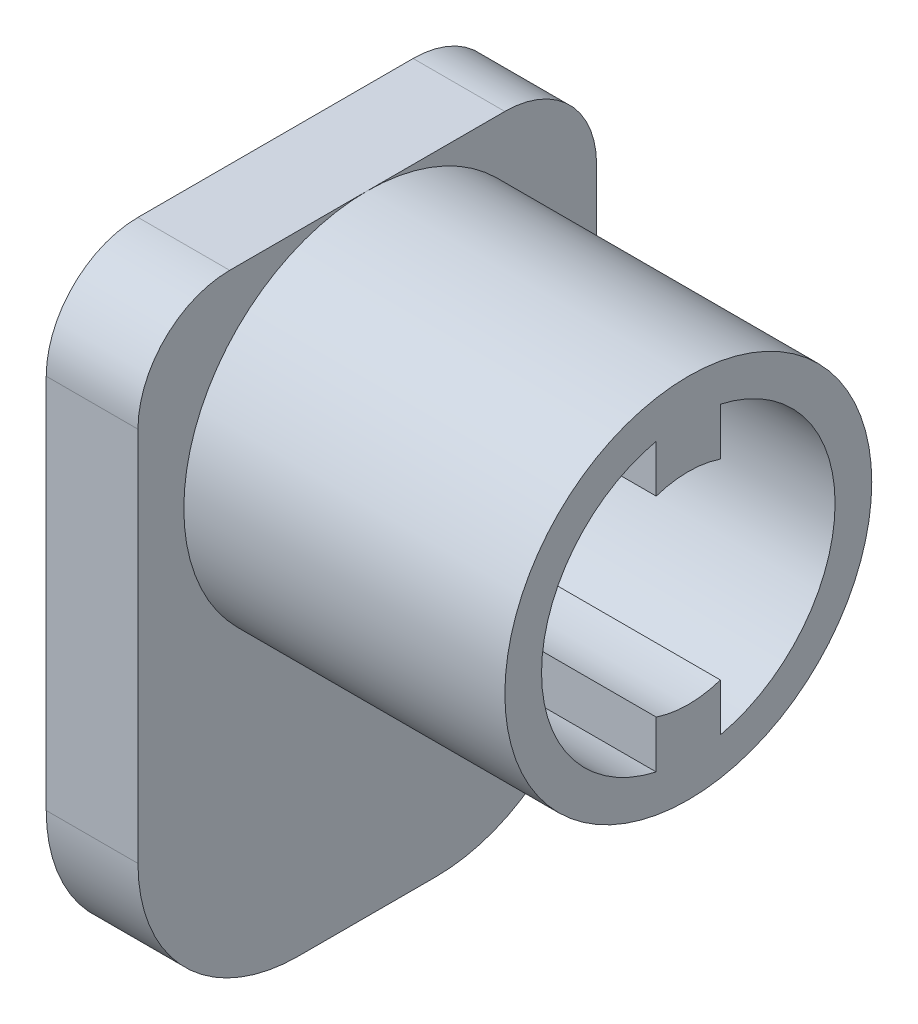
ISO-10303-21;
HEADER;
FILE_DESCRIPTION(('STEP AP214'),'2;1');
FILE_NAME('part.step','',(''),(''),'','','');
FILE_SCHEMA(('AUTOMOTIVE_DESIGN { 1 0 10303 214 1 1 1 1 }'));
ENDSEC;
DATA;
#1=APPLICATION_CONTEXT('core data for automotive mechanical design processes');
#2=APPLICATION_PROTOCOL_DEFINITION('international standard','automotive_design',2000,#1);
#3=PRODUCT_CONTEXT('',#1,'mechanical');
#4=PRODUCT('Part','Part','',(#3));
#5=PRODUCT_RELATED_PRODUCT_CATEGORY('part','',(#4));
#6=PRODUCT_DEFINITION_FORMATION('','',#4);
#7=PRODUCT_DEFINITION_CONTEXT('part definition',#1,'design');
#8=PRODUCT_DEFINITION('design','',#6,#7);
#9=PRODUCT_DEFINITION_SHAPE('','',#8);
#10=(LENGTH_UNIT() NAMED_UNIT(*) SI_UNIT(.MILLI.,.METRE.));
#11=(NAMED_UNIT(*) PLANE_ANGLE_UNIT() SI_UNIT($,.RADIAN.));
#12=(NAMED_UNIT(*) SI_UNIT($,.STERADIAN.) SOLID_ANGLE_UNIT());
#13=UNCERTAINTY_MEASURE_WITH_UNIT(LENGTH_MEASURE(1.E-05),#10,'distance_accuracy_value','');
#14=(GEOMETRIC_REPRESENTATION_CONTEXT(3) GLOBAL_UNCERTAINTY_ASSIGNED_CONTEXT((#13)) GLOBAL_UNIT_ASSIGNED_CONTEXT((#10,
#11,#12)) REPRESENTATION_CONTEXT('',''));
#15=CARTESIAN_POINT('',(0.,0.,0.));
#16=DIRECTION('',(0.,0.,1.));
#17=DIRECTION('',(1.,0.,0.));
#18=AXIS2_PLACEMENT_3D('',#15,#16,#17);
#19=CARTESIAN_POINT('',(-16.0509667991878,0.,0.));
#20=DIRECTION('',(1.,0.,0.));
#21=DIRECTION('',(0.,0.,-1.));
#22=AXIS2_PLACEMENT_3D('',#19,#20,#21);
#23=CYLINDRICAL_SURFACE('',#22,3.2);
#24=CARTESIAN_POINT('',(-7.,0.,0.));
#25=DIRECTION('',(-1.,0.,0.));
#26=DIRECTION('',(0.,0.,1.));
#27=AXIS2_PLACEMENT_3D('',#24,#25,#26);
#28=CIRCLE('',#27,3.2);
#29=CARTESIAN_POINT('',(-7.,3.1224989991992,0.7));
#30=VERTEX_POINT('',#29);
#31=CARTESIAN_POINT('',(-7.,-3.1224989991992,0.699999999999999));
#32=VERTEX_POINT('',#31);
#33=EDGE_CURVE('E165',#30,#32,#28,.F.);
#34=ORIENTED_EDGE('',*,*,#33,.F.);
#35=DIRECTION('',(-1.,0.,0.));
#36=VECTOR('',#35,1.);
#37=CARTESIAN_POINT('',(1.78934113199437,3.1224989991992,0.7));
#38=LINE('',#37,#36);
#39=CARTESIAN_POINT('',(0.,3.1224989991992,0.7));
#40=VERTEX_POINT('',#39);
#41=EDGE_CURVE('E152',#40,#30,#38,.T.);
#42=ORIENTED_EDGE('',*,*,#41,.F.);
#43=CARTESIAN_POINT('',(0.,0.,0.));
#44=DIRECTION('',(1.,0.,0.));
#45=DIRECTION('',(0.,0.,-1.));
#46=AXIS2_PLACEMENT_3D('',#43,#44,#45);
#47=CIRCLE('',#46,3.2);
#48=CARTESIAN_POINT('',(0.,-3.1224989991992,0.7));
#49=VERTEX_POINT('',#48);
#50=EDGE_CURVE('E163',#40,#49,#47,.T.);
#51=ORIENTED_EDGE('',*,*,#50,.T.);
#52=DIRECTION('',(-1.,0.,0.));
#53=VECTOR('',#52,1.);
#54=CARTESIAN_POINT('',(1.78934113199437,-3.1224989991992,0.7));
#55=LINE('',#54,#53);
#56=EDGE_CURVE('E338',#49,#32,#55,.T.);
#57=ORIENTED_EDGE('',*,*,#56,.T.);
#58=EDGE_LOOP('',(#34,#42,#51,#57));
#59=FACE_BOUND('',#58,.T.);
#60=ADVANCED_FACE('F31',(#59),#23,.F.);
#61=CARTESIAN_POINT('',(-7.,0.,0.));
#62=DIRECTION('',(1.,0.,0.));
#63=DIRECTION('',(0.,0.,-1.));
#64=AXIS2_PLACEMENT_3D('',#61,#62,#63);
#65=CYLINDRICAL_SURFACE('',#64,4.);
#66=CARTESIAN_POINT('',(-7.,0.,0.));
#67=DIRECTION('',(1.,0.,0.));
#68=DIRECTION('',(0.,0.,-1.));
#69=AXIS2_PLACEMENT_3D('',#66,#67,#68);
#70=CIRCLE('',#69,4.);
#71=CARTESIAN_POINT('',(-7.,4.,0.));
#72=VERTEX_POINT('',#71);
#73=EDGE_CURVE('E207',#72,#72,#70,.T.);
#74=ORIENTED_EDGE('',*,*,#73,.T.);
#75=EDGE_LOOP('',(#74));
#76=FACE_BOUND('',#75,.T.);
#77=CARTESIAN_POINT('',(0.,0.,0.));
#78=DIRECTION('',(1.,0.,0.));
#79=DIRECTION('',(0.,0.,-1.));
#80=AXIS2_PLACEMENT_3D('',#77,#78,#79);
#81=CIRCLE('',#80,4.);
#82=CARTESIAN_POINT('',(0.,0.,-4.));
#83=VERTEX_POINT('',#82);
#84=EDGE_CURVE('E198',#83,#83,#81,.T.);
#85=ORIENTED_EDGE('',*,*,#84,.F.);
#86=EDGE_LOOP('',(#85));
#87=FACE_BOUND('',#86,.T.);
#88=ADVANCED_FACE('F278',(#76,#87),#65,.T.);
#89=CARTESIAN_POINT('',(0.,0.,0.));
#90=DIRECTION('',(1.,0.,0.));
#91=DIRECTION('',(0.,0.,-1.));
#92=AXIS2_PLACEMENT_3D('',#89,#90,#91);
#93=PLANE('',#92);
#94=CARTESIAN_POINT('',(0.,-3.1224989991992,-0.7));
#95=VERTEX_POINT('',#94);
#96=CARTESIAN_POINT('',(0.,3.1224989991992,-0.700000000000001));
#97=VERTEX_POINT('',#96);
#98=EDGE_CURVE('E174',#95,#97,#47,.T.);
#99=ORIENTED_EDGE('',*,*,#98,.F.);
#100=DIRECTION('',(0.,-1.,0.));
#101=VECTOR('',#100,1.);
#102=CARTESIAN_POINT('',(0.,-2.86181760425084,-0.700000000000001));
#103=LINE('',#102,#101);
#104=CARTESIAN_POINT('',(0.,-2.08566536146142,-0.700000000000001));
#105=VERTEX_POINT('',#104);
#106=EDGE_CURVE('E312',#105,#95,#103,.T.);
#107=ORIENTED_EDGE('',*,*,#106,.F.);
#108=CARTESIAN_POINT('',(0.,0.,0.));
#109=DIRECTION('',(1.,0.,0.));
#110=DIRECTION('',(0.,0.,-1.));
#111=AXIS2_PLACEMENT_3D('',#108,#109,#110);
#112=CIRCLE('',#111,2.2);
#113=CARTESIAN_POINT('',(0.,-2.08566536146142,0.7));
#114=VERTEX_POINT('',#113);
#115=EDGE_CURVE('E333',#114,#105,#112,.T.);
#116=ORIENTED_EDGE('',*,*,#115,.F.);
#117=DIRECTION('',(0.,1.,0.));
#118=VECTOR('',#117,1.);
#119=CARTESIAN_POINT('',(0.,-2.86181760425084,0.699999999999999));
#120=LINE('',#119,#118);
#121=EDGE_CURVE('E172',#49,#114,#120,.T.);
#122=ORIENTED_EDGE('',*,*,#121,.F.);
#123=ORIENTED_EDGE('',*,*,#50,.F.);
#124=DIRECTION('',(0.,1.,0.));
#125=VECTOR('',#124,1.);
#126=CARTESIAN_POINT('',(0.,2.86181760425084,0.7));
#127=LINE('',#126,#125);
#128=CARTESIAN_POINT('',(0.,2.08566536146142,0.699999999999999));
#129=VERTEX_POINT('',#128);
#130=EDGE_CURVE('E149',#129,#40,#127,.T.);
#131=ORIENTED_EDGE('',*,*,#130,.F.);
#132=CARTESIAN_POINT('',(0.,0.,0.));
#133=DIRECTION('',(1.,0.,0.));
#134=DIRECTION('',(0.,0.,-1.));
#135=AXIS2_PLACEMENT_3D('',#132,#133,#134);
#136=CIRCLE('',#135,2.2);
#137=CARTESIAN_POINT('',(0.,2.08566536146142,-0.700000000000001));
#138=VERTEX_POINT('',#137);
#139=EDGE_CURVE('E316',#138,#129,#136,.T.);
#140=ORIENTED_EDGE('',*,*,#139,.F.);
#141=DIRECTION('',(0.,-1.,0.));
#142=VECTOR('',#141,1.);
#143=CARTESIAN_POINT('',(0.,2.08566536146142,-0.700000000000001));
#144=LINE('',#143,#142);
#145=EDGE_CURVE('E315',#97,#138,#144,.T.);
#146=ORIENTED_EDGE('',*,*,#145,.F.);
#147=EDGE_LOOP('',(#99,#107,#116,#122,#123,#131,#140,#146));
#148=FACE_BOUND('',#147,.T.);
#149=ORIENTED_EDGE('',*,*,#84,.T.);
#150=EDGE_LOOP('',(#149));
#151=FACE_BOUND('',#150,.T.);
#152=ADVANCED_FACE('F169',(#148,#151),#93,.T.);
#153=CARTESIAN_POINT('',(-9.,4.,-5.));
#154=DIRECTION('',(0.,0.,1.));
#155=DIRECTION('',(0.,-1.,0.));
#156=AXIS2_PLACEMENT_3D('',#153,#154,#155);
#157=PLANE('',#156);
#158=DIRECTION('',(0.,-1.,0.));
#159=VECTOR('',#158,1.);
#160=CARTESIAN_POINT('',(-7.,4.,-5.));
#161=LINE('',#160,#159);
#162=CARTESIAN_POINT('',(-7.,2.,-5.));
#163=VERTEX_POINT('',#162);
#164=CARTESIAN_POINT('',(-7.,-6.2,-5.));
#165=VERTEX_POINT('',#164);
#166=EDGE_CURVE('E187',#163,#165,#161,.T.);
#167=ORIENTED_EDGE('',*,*,#166,.T.);
#168=DIRECTION('',(1.,0.,0.));
#169=VECTOR('',#168,1.);
#170=CARTESIAN_POINT('',(-9.,-6.2,-5.));
#171=LINE('',#170,#169);
#172=CARTESIAN_POINT('',(-9.,-6.2,-5.));
#173=VERTEX_POINT('',#172);
#174=EDGE_CURVE('E54',#165,#173,#171,.F.);
#175=ORIENTED_EDGE('',*,*,#174,.T.);
#176=DIRECTION('',(0.,-1.,0.));
#177=VECTOR('',#176,1.);
#178=CARTESIAN_POINT('',(-9.,4.,-5.));
#179=LINE('',#178,#177);
#180=CARTESIAN_POINT('',(-9.,2.,-5.));
#181=VERTEX_POINT('',#180);
#182=EDGE_CURVE('E188',#181,#173,#179,.T.);
#183=ORIENTED_EDGE('',*,*,#182,.F.);
#184=DIRECTION('',(1.,0.,0.));
#185=VECTOR('',#184,1.);
#186=CARTESIAN_POINT('',(-9.,2.,-5.));
#187=LINE('',#186,#185);
#188=EDGE_CURVE('E235',#181,#163,#187,.T.);
#189=ORIENTED_EDGE('',*,*,#188,.T.);
#190=EDGE_LOOP('',(#167,#175,#183,#189));
#191=FACE_BOUND('',#190,.T.);
#192=ADVANCED_FACE('F261',(#191),#157,.F.);
#193=CARTESIAN_POINT('',(-9.,-9.7,-5.));
#194=DIRECTION('',(0.,1.,0.));
#195=DIRECTION('',(0.,0.,1.));
#196=AXIS2_PLACEMENT_3D('',#193,#194,#195);
#197=PLANE('',#196);
#198=DIRECTION('',(0.,0.,1.));
#199=VECTOR('',#198,1.);
#200=CARTESIAN_POINT('',(-9.,-9.7,-5.));
#201=LINE('',#200,#199);
#202=CARTESIAN_POINT('',(-9.,-9.7,-1.5));
#203=VERTEX_POINT('',#202);
#204=CARTESIAN_POINT('',(-9.,-9.7,1.5));
#205=VERTEX_POINT('',#204);
#206=EDGE_CURVE('E190',#203,#205,#201,.T.);
#207=ORIENTED_EDGE('',*,*,#206,.F.);
#208=DIRECTION('',(1.,0.,0.));
#209=VECTOR('',#208,1.);
#210=CARTESIAN_POINT('',(-9.,-9.7,-1.5));
#211=LINE('',#210,#209);
#212=CARTESIAN_POINT('',(-7.,-9.7,-1.5));
#213=VERTEX_POINT('',#212);
#214=EDGE_CURVE('E240',#203,#213,#211,.T.);
#215=ORIENTED_EDGE('',*,*,#214,.T.);
#216=DIRECTION('',(0.,0.,1.));
#217=VECTOR('',#216,1.);
#218=CARTESIAN_POINT('',(-7.,-9.7,-5.));
#219=LINE('',#218,#217);
#220=CARTESIAN_POINT('',(-7.,-9.7,1.5));
#221=VERTEX_POINT('',#220);
#222=EDGE_CURVE('E200',#213,#221,#219,.T.);
#223=ORIENTED_EDGE('',*,*,#222,.T.);
#224=DIRECTION('',(1.,0.,0.));
#225=VECTOR('',#224,1.);
#226=CARTESIAN_POINT('',(-9.,-9.7,1.5));
#227=LINE('',#226,#225);
#228=EDGE_CURVE('E238',#221,#205,#227,.F.);
#229=ORIENTED_EDGE('',*,*,#228,.T.);
#230=EDGE_LOOP('',(#207,#215,#223,#229));
#231=FACE_BOUND('',#230,.T.);
#232=ADVANCED_FACE('F254',(#231),#197,.F.);
#233=CARTESIAN_POINT('',(-9.,4.,5.));
#234=DIRECTION('',(0.,0.,-1.));
#235=DIRECTION('',(0.,1.,0.));
#236=AXIS2_PLACEMENT_3D('',#233,#234,#235);
#237=PLANE('',#236);
#238=DIRECTION('',(0.,1.,0.));
#239=VECTOR('',#238,1.);
#240=CARTESIAN_POINT('',(-9.,4.,5.));
#241=LINE('',#240,#239);
#242=CARTESIAN_POINT('',(-9.,-6.2,5.));
#243=VERTEX_POINT('',#242);
#244=CARTESIAN_POINT('',(-9.,2.,5.));
#245=VERTEX_POINT('',#244);
#246=EDGE_CURVE('E193',#243,#245,#241,.T.);
#247=ORIENTED_EDGE('',*,*,#246,.F.);
#248=DIRECTION('',(1.,0.,0.));
#249=VECTOR('',#248,1.);
#250=CARTESIAN_POINT('',(-9.,-6.2,5.));
#251=LINE('',#250,#249);
#252=CARTESIAN_POINT('',(-7.,-6.2,5.));
#253=VERTEX_POINT('',#252);
#254=EDGE_CURVE('E11',#243,#253,#251,.T.);
#255=ORIENTED_EDGE('',*,*,#254,.T.);
#256=DIRECTION('',(0.,1.,0.));
#257=VECTOR('',#256,1.);
#258=CARTESIAN_POINT('',(-7.,4.,5.));
#259=LINE('',#258,#257);
#260=CARTESIAN_POINT('',(-7.,2.,5.));
#261=VERTEX_POINT('',#260);
#262=EDGE_CURVE('E203',#253,#261,#259,.T.);
#263=ORIENTED_EDGE('',*,*,#262,.T.);
#264=DIRECTION('',(1.,0.,0.));
#265=VECTOR('',#264,1.);
#266=CARTESIAN_POINT('',(-9.,2.,5.));
#267=LINE('',#266,#265);
#268=EDGE_CURVE('E228',#261,#245,#267,.F.);
#269=ORIENTED_EDGE('',*,*,#268,.T.);
#270=EDGE_LOOP('',(#247,#255,#263,#269));
#271=FACE_BOUND('',#270,.T.);
#272=ADVANCED_FACE('F361',(#271),#237,.F.);
#273=CARTESIAN_POINT('',(-9.,4.,-5.));
#274=DIRECTION('',(0.,-1.,0.));
#275=DIRECTION('',(0.,0.,-1.));
#276=AXIS2_PLACEMENT_3D('',#273,#274,#275);
#277=PLANE('',#276);
#278=DIRECTION('',(0.,0.,-1.));
#279=VECTOR('',#278,1.);
#280=CARTESIAN_POINT('',(-9.,4.,-5.));
#281=LINE('',#280,#279);
#282=CARTESIAN_POINT('',(-9.,4.,3.));
#283=VERTEX_POINT('',#282);
#284=CARTESIAN_POINT('',(-9.,4.,-3.));
#285=VERTEX_POINT('',#284);
#286=EDGE_CURVE('E195',#283,#285,#281,.T.);
#287=ORIENTED_EDGE('',*,*,#286,.F.);
#288=DIRECTION('',(1.,0.,0.));
#289=VECTOR('',#288,1.);
#290=CARTESIAN_POINT('',(-9.,4.,3.));
#291=LINE('',#290,#289);
#292=CARTESIAN_POINT('',(-7.,4.,3.));
#293=VERTEX_POINT('',#292);
#294=EDGE_CURVE('E220',#283,#293,#291,.T.);
#295=ORIENTED_EDGE('',*,*,#294,.T.);
#296=DIRECTION('',(0.,0.,-1.));
#297=VECTOR('',#296,1.);
#298=CARTESIAN_POINT('',(-7.,4.,-5.));
#299=LINE('',#298,#297);
#300=EDGE_CURVE('E191',#293,#72,#299,.T.);
#301=ORIENTED_EDGE('',*,*,#300,.T.);
#302=CARTESIAN_POINT('',(-7.,4.,-3.));
#303=VERTEX_POINT('',#302);
#304=EDGE_CURVE('E205',#72,#303,#299,.T.);
#305=ORIENTED_EDGE('',*,*,#304,.T.);
#306=DIRECTION('',(1.,0.,0.));
#307=VECTOR('',#306,1.);
#308=CARTESIAN_POINT('',(-9.,4.,-3.));
#309=LINE('',#308,#307);
#310=EDGE_CURVE('E218',#303,#285,#309,.F.);
#311=ORIENTED_EDGE('',*,*,#310,.T.);
#312=EDGE_LOOP('',(#287,#295,#301,#305,#311));
#313=FACE_BOUND('',#312,.T.);
#314=ADVANCED_FACE('F272',(#313),#277,.F.);
#315=CARTESIAN_POINT('',(-9.,-9.7,-5.));
#316=DIRECTION('',(-1.,0.,0.));
#317=DIRECTION('',(0.,0.,1.));
#318=AXIS2_PLACEMENT_3D('',#315,#316,#317);
#319=PLANE('',#318);
#320=CARTESIAN_POINT('',(-9.,0.,0.));
#321=DIRECTION('',(-1.,0.,0.));
#322=DIRECTION('',(0.,0.,1.));
#323=AXIS2_PLACEMENT_3D('',#320,#321,#322);
#324=CIRCLE('',#323,1.6);
#325=CARTESIAN_POINT('',(-9.,0.,1.6));
#326=VERTEX_POINT('',#325);
#327=EDGE_CURVE('E179',#326,#326,#324,.T.);
#328=ORIENTED_EDGE('',*,*,#327,.F.);
#329=EDGE_LOOP('',(#328));
#330=FACE_BOUND('',#329,.T.);
#331=ORIENTED_EDGE('',*,*,#182,.T.);
#332=CARTESIAN_POINT('',(-9.,-6.2,-1.5));
#333=DIRECTION('',(-1.,0.,0.));
#334=DIRECTION('',(0.,0.,1.));
#335=AXIS2_PLACEMENT_3D('',#332,#333,#334);
#336=CIRCLE('',#335,3.5);
#337=EDGE_CURVE('E39',#173,#203,#336,.T.);
#338=ORIENTED_EDGE('',*,*,#337,.T.);
#339=ORIENTED_EDGE('',*,*,#206,.T.);
#340=CARTESIAN_POINT('',(-9.,-6.2,1.5));
#341=DIRECTION('',(-1.,0.,0.));
#342=DIRECTION('',(0.,0.,1.));
#343=AXIS2_PLACEMENT_3D('',#340,#341,#342);
#344=CIRCLE('',#343,3.5);
#345=EDGE_CURVE('E46',#205,#243,#344,.T.);
#346=ORIENTED_EDGE('',*,*,#345,.T.);
#347=ORIENTED_EDGE('',*,*,#246,.T.);
#348=CARTESIAN_POINT('',(-9.,2.,3.));
#349=DIRECTION('',(-1.,0.,0.));
#350=DIRECTION('',(0.,0.,1.));
#351=AXIS2_PLACEMENT_3D('',#348,#349,#350);
#352=CIRCLE('',#351,2.);
#353=EDGE_CURVE('E233',#245,#283,#352,.T.);
#354=ORIENTED_EDGE('',*,*,#353,.T.);
#355=ORIENTED_EDGE('',*,*,#286,.T.);
#356=CARTESIAN_POINT('',(-9.,2.,-3.));
#357=DIRECTION('',(-1.,0.,0.));
#358=DIRECTION('',(0.,0.,1.));
#359=AXIS2_PLACEMENT_3D('',#356,#357,#358);
#360=CIRCLE('',#359,2.);
#361=EDGE_CURVE('E231',#285,#181,#360,.T.);
#362=ORIENTED_EDGE('',*,*,#361,.T.);
#363=EDGE_LOOP('',(#331,#338,#339,#346,#347,#354,#355,#362));
#364=FACE_BOUND('',#363,.T.);
#365=ADVANCED_FACE('F250',(#330,#364),#319,.T.);
#366=CARTESIAN_POINT('',(-7.,-9.7,-5.));
#367=DIRECTION('',(-1.,0.,0.));
#368=DIRECTION('',(0.,0.,1.));
#369=AXIS2_PLACEMENT_3D('',#366,#367,#368);
#370=PLANE('',#369);
#371=ORIENTED_EDGE('',*,*,#222,.F.);
#372=CARTESIAN_POINT('',(-7.,-6.2,-1.5));
#373=DIRECTION('',(-1.,0.,0.));
#374=DIRECTION('',(0.,0.,1.));
#375=AXIS2_PLACEMENT_3D('',#372,#373,#374);
#376=CIRCLE('',#375,3.5);
#377=EDGE_CURVE('E245',#213,#165,#376,.F.);
#378=ORIENTED_EDGE('',*,*,#377,.T.);
#379=ORIENTED_EDGE('',*,*,#166,.F.);
#380=CARTESIAN_POINT('',(-7.,2.,-3.));
#381=DIRECTION('',(-1.,0.,0.));
#382=DIRECTION('',(0.,0.,1.));
#383=AXIS2_PLACEMENT_3D('',#380,#381,#382);
#384=CIRCLE('',#383,2.);
#385=EDGE_CURVE('E223',#163,#303,#384,.F.);
#386=ORIENTED_EDGE('',*,*,#385,.T.);
#387=ORIENTED_EDGE('',*,*,#304,.F.);
#388=ORIENTED_EDGE('',*,*,#73,.F.);
#389=ORIENTED_EDGE('',*,*,#300,.F.);
#390=CARTESIAN_POINT('',(-7.,2.,3.));
#391=DIRECTION('',(-1.,0.,0.));
#392=DIRECTION('',(0.,0.,1.));
#393=AXIS2_PLACEMENT_3D('',#390,#391,#392);
#394=CIRCLE('',#393,2.);
#395=EDGE_CURVE('E225',#293,#261,#394,.F.);
#396=ORIENTED_EDGE('',*,*,#395,.T.);
#397=ORIENTED_EDGE('',*,*,#262,.F.);
#398=CARTESIAN_POINT('',(-7.,-6.2,1.5));
#399=DIRECTION('',(-1.,0.,0.));
#400=DIRECTION('',(0.,0.,1.));
#401=AXIS2_PLACEMENT_3D('',#398,#399,#400);
#402=CIRCLE('',#401,3.5);
#403=EDGE_CURVE('E243',#253,#221,#402,.F.);
#404=ORIENTED_EDGE('',*,*,#403,.T.);
#405=EDGE_LOOP('',(#371,#378,#379,#386,#387,#388,#389,#396,#397,#404));
#406=FACE_BOUND('',#405,.T.);
#407=ADVANCED_FACE('F260',(#406),#370,.F.);
#408=CARTESIAN_POINT('',(-7.,-9.7,-5.));
#409=DIRECTION('',(-1.,0.,0.));
#410=DIRECTION('',(0.,0.,1.));
#411=AXIS2_PLACEMENT_3D('',#408,#409,#410);
#412=PLANE('',#411);
#413=CARTESIAN_POINT('',(-7.,0.,0.));
#414=DIRECTION('',(-1.,0.,0.));
#415=DIRECTION('',(0.,0.,1.));
#416=AXIS2_PLACEMENT_3D('',#413,#414,#415);
#417=CIRCLE('',#416,1.6);
#418=CARTESIAN_POINT('',(-7.,0.,1.6));
#419=VERTEX_POINT('',#418);
#420=EDGE_CURVE('E175',#419,#419,#417,.T.);
#421=ORIENTED_EDGE('',*,*,#420,.T.);
#422=EDGE_LOOP('',(#421));
#423=FACE_BOUND('',#422,.T.);
#424=CARTESIAN_POINT('',(-7.,0.,0.));
#425=DIRECTION('',(-1.,0.,0.));
#426=DIRECTION('',(0.,0.,1.));
#427=AXIS2_PLACEMENT_3D('',#424,#425,#426);
#428=CIRCLE('',#427,2.2);
#429=CARTESIAN_POINT('',(-7.,2.08566536146142,-0.700000000000001));
#430=VERTEX_POINT('',#429);
#431=CARTESIAN_POINT('',(-7.,2.08566536146142,0.7));
#432=VERTEX_POINT('',#431);
#433=EDGE_CURVE('E215',#430,#432,#428,.F.);
#434=ORIENTED_EDGE('',*,*,#433,.T.);
#435=DIRECTION('',(0.,1.,0.));
#436=VECTOR('',#435,1.);
#437=CARTESIAN_POINT('',(-7.,-9.7,0.699999999999989));
#438=LINE('',#437,#436);
#439=EDGE_CURVE('E330',#432,#30,#438,.T.);
#440=ORIENTED_EDGE('',*,*,#439,.T.);
#441=ORIENTED_EDGE('',*,*,#33,.T.);
#442=DIRECTION('',(0.,1.,0.));
#443=VECTOR('',#442,1.);
#444=CARTESIAN_POINT('',(-7.,-9.7,0.699999999999997));
#445=LINE('',#444,#443);
#446=CARTESIAN_POINT('',(-7.,-2.08566536146142,0.7));
#447=VERTEX_POINT('',#446);
#448=EDGE_CURVE('E345',#32,#447,#445,.T.);
#449=ORIENTED_EDGE('',*,*,#448,.T.);
#450=CARTESIAN_POINT('',(-7.,0.,0.));
#451=DIRECTION('',(-1.,0.,0.));
#452=DIRECTION('',(0.,0.,1.));
#453=AXIS2_PLACEMENT_3D('',#450,#451,#452);
#454=CIRCLE('',#453,2.2);
#455=CARTESIAN_POINT('',(-7.,-2.08566536146142,-0.700000000000001));
#456=VERTEX_POINT('',#455);
#457=EDGE_CURVE('E210',#447,#456,#454,.F.);
#458=ORIENTED_EDGE('',*,*,#457,.T.);
#459=DIRECTION('',(0.,-1.,0.));
#460=VECTOR('',#459,1.);
#461=CARTESIAN_POINT('',(-7.,-9.7,-0.700000000000001));
#462=LINE('',#461,#460);
#463=CARTESIAN_POINT('',(-7.,-3.1224989991992,-0.7));
#464=VERTEX_POINT('',#463);
#465=EDGE_CURVE('E347',#456,#464,#462,.T.);
#466=ORIENTED_EDGE('',*,*,#465,.T.);
#467=CARTESIAN_POINT('',(-7.,3.1224989991992,-0.7));
#468=VERTEX_POINT('',#467);
#469=EDGE_CURVE('E184',#464,#468,#28,.F.);
#470=ORIENTED_EDGE('',*,*,#469,.T.);
#471=DIRECTION('',(0.,-1.,0.));
#472=VECTOR('',#471,1.);
#473=CARTESIAN_POINT('',(-7.,-9.7,-0.700000000000006));
#474=LINE('',#473,#472);
#475=EDGE_CURVE('E324',#468,#430,#474,.T.);
#476=ORIENTED_EDGE('',*,*,#475,.T.);
#477=EDGE_LOOP('',(#434,#440,#441,#449,#458,#466,#470,#476));
#478=FACE_BOUND('',#477,.T.);
#479=ADVANCED_FACE('F298',(#423,#478),#412,.F.);
#480=ORIENTED_EDGE('',*,*,#98,.T.);
#481=DIRECTION('',(-1.,0.,0.));
#482=VECTOR('',#481,1.);
#483=CARTESIAN_POINT('',(1.78934113199437,3.1224989991992,-0.700000000000001));
#484=LINE('',#483,#482);
#485=EDGE_CURVE('E166',#97,#468,#484,.T.);
#486=ORIENTED_EDGE('',*,*,#485,.T.);
#487=ORIENTED_EDGE('',*,*,#469,.F.);
#488=DIRECTION('',(-1.,0.,0.));
#489=VECTOR('',#488,1.);
#490=CARTESIAN_POINT('',(1.78934113199437,-3.1224989991992,-0.7));
#491=LINE('',#490,#489);
#492=EDGE_CURVE('E311',#95,#464,#491,.T.);
#493=ORIENTED_EDGE('',*,*,#492,.F.);
#494=EDGE_LOOP('',(#480,#486,#487,#493));
#495=FACE_BOUND('',#494,.T.);
#496=ADVANCED_FACE('F291',(#495),#23,.F.);
#497=CARTESIAN_POINT('',(0.,0.,0.));
#498=DIRECTION('',(-1.,0.,0.));
#499=DIRECTION('',(0.,0.,1.));
#500=AXIS2_PLACEMENT_3D('',#497,#498,#499);
#501=CYLINDRICAL_SURFACE('',#500,1.6);
#502=ORIENTED_EDGE('',*,*,#327,.T.);
#503=EDGE_LOOP('',(#502));
#504=FACE_BOUND('',#503,.T.);
#505=ORIENTED_EDGE('',*,*,#420,.F.);
#506=EDGE_LOOP('',(#505));
#507=FACE_BOUND('',#506,.T.);
#508=ADVANCED_FACE('F297',(#504,#507),#501,.F.);
#509=CARTESIAN_POINT('',(1.78934113199437,0.,0.));
#510=DIRECTION('',(-1.,0.,0.));
#511=DIRECTION('',(0.,0.,1.));
#512=AXIS2_PLACEMENT_3D('',#509,#510,#511);
#513=CYLINDRICAL_SURFACE('',#512,2.2);
#514=ORIENTED_EDGE('',*,*,#457,.F.);
#515=DIRECTION('',(-1.,0.,0.));
#516=VECTOR('',#515,1.);
#517=CARTESIAN_POINT('',(1.78934113199437,-2.08566536146142,0.7));
#518=LINE('',#517,#516);
#519=EDGE_CURVE('E336',#114,#447,#518,.T.);
#520=ORIENTED_EDGE('',*,*,#519,.F.);
#521=ORIENTED_EDGE('',*,*,#115,.T.);
#522=DIRECTION('',(-1.,0.,0.));
#523=VECTOR('',#522,1.);
#524=CARTESIAN_POINT('',(1.78934113199437,-2.08566536146142,-0.700000000000001));
#525=LINE('',#524,#523);
#526=EDGE_CURVE('E335',#105,#456,#525,.T.);
#527=ORIENTED_EDGE('',*,*,#526,.T.);
#528=EDGE_LOOP('',(#514,#520,#521,#527));
#529=FACE_BOUND('',#528,.T.);
#530=ADVANCED_FACE('F304',(#529),#513,.F.);
#531=CARTESIAN_POINT('',(1.78934113199437,-2.86181760425084,-0.700000000000001));
#532=DIRECTION('',(0.,0.,-1.));
#533=DIRECTION('',(-1.,0.,0.));
#534=AXIS2_PLACEMENT_3D('',#531,#532,#533);
#535=PLANE('',#534);
#536=ORIENTED_EDGE('',*,*,#465,.F.);
#537=ORIENTED_EDGE('',*,*,#526,.F.);
#538=ORIENTED_EDGE('',*,*,#106,.T.);
#539=ORIENTED_EDGE('',*,*,#492,.T.);
#540=EDGE_LOOP('',(#536,#537,#538,#539));
#541=FACE_BOUND('',#540,.T.);
#542=ADVANCED_FACE('F460',(#541),#535,.T.);
#543=CARTESIAN_POINT('',(1.78934113199437,-2.86181760425084,0.699999999999999));
#544=DIRECTION('',(0.,0.,1.));
#545=DIRECTION('',(0.,-1.,0.));
#546=AXIS2_PLACEMENT_3D('',#543,#544,#545);
#547=PLANE('',#546);
#548=ORIENTED_EDGE('',*,*,#448,.F.);
#549=ORIENTED_EDGE('',*,*,#56,.F.);
#550=ORIENTED_EDGE('',*,*,#121,.T.);
#551=ORIENTED_EDGE('',*,*,#519,.T.);
#552=EDGE_LOOP('',(#548,#549,#550,#551));
#553=FACE_BOUND('',#552,.T.);
#554=ADVANCED_FACE('F471',(#553),#547,.T.);
#555=CARTESIAN_POINT('',(1.78934113199437,0.,0.));
#556=DIRECTION('',(-1.,0.,0.));
#557=DIRECTION('',(0.,0.,1.));
#558=AXIS2_PLACEMENT_3D('',#555,#556,#557);
#559=CYLINDRICAL_SURFACE('',#558,2.2);
#560=ORIENTED_EDGE('',*,*,#433,.F.);
#561=DIRECTION('',(-1.,0.,0.));
#562=VECTOR('',#561,1.);
#563=CARTESIAN_POINT('',(1.78934113199437,2.08566536146142,-0.700000000000001));
#564=LINE('',#563,#562);
#565=EDGE_CURVE('E320',#138,#430,#564,.T.);
#566=ORIENTED_EDGE('',*,*,#565,.F.);
#567=ORIENTED_EDGE('',*,*,#139,.T.);
#568=DIRECTION('',(-1.,0.,0.));
#569=VECTOR('',#568,1.);
#570=CARTESIAN_POINT('',(1.78934113199437,2.08566536146142,0.7));
#571=LINE('',#570,#569);
#572=EDGE_CURVE('E155',#129,#432,#571,.T.);
#573=ORIENTED_EDGE('',*,*,#572,.T.);
#574=EDGE_LOOP('',(#560,#566,#567,#573));
#575=FACE_BOUND('',#574,.T.);
#576=ADVANCED_FACE('F482',(#575),#559,.F.);
#577=CARTESIAN_POINT('',(1.78934113199437,2.86181760425084,0.7));
#578=DIRECTION('',(0.,0.,1.));
#579=DIRECTION('',(0.,-1.,0.));
#580=AXIS2_PLACEMENT_3D('',#577,#578,#579);
#581=PLANE('',#580);
#582=ORIENTED_EDGE('',*,*,#439,.F.);
#583=ORIENTED_EDGE('',*,*,#572,.F.);
#584=ORIENTED_EDGE('',*,*,#130,.T.);
#585=ORIENTED_EDGE('',*,*,#41,.T.);
#586=EDGE_LOOP('',(#582,#583,#584,#585));
#587=FACE_BOUND('',#586,.T.);
#588=ADVANCED_FACE('F151',(#587),#581,.T.);
#589=CARTESIAN_POINT('',(1.78934113199437,2.08566536146142,-0.700000000000001));
#590=DIRECTION('',(0.,0.,-1.));
#591=DIRECTION('',(0.,1.,0.));
#592=AXIS2_PLACEMENT_3D('',#589,#590,#591);
#593=PLANE('',#592);
#594=ORIENTED_EDGE('',*,*,#475,.F.);
#595=ORIENTED_EDGE('',*,*,#485,.F.);
#596=ORIENTED_EDGE('',*,*,#145,.T.);
#597=ORIENTED_EDGE('',*,*,#565,.T.);
#598=EDGE_LOOP('',(#594,#595,#596,#597));
#599=FACE_BOUND('',#598,.T.);
#600=ADVANCED_FACE('F322',(#599),#593,.T.);
#601=CARTESIAN_POINT('',(-9.,2.,3.));
#602=DIRECTION('',(1.,0.,0.));
#603=DIRECTION('',(0.,0.,-1.));
#604=AXIS2_PLACEMENT_3D('',#601,#602,#603);
#605=CYLINDRICAL_SURFACE('',#604,2.);
#606=ORIENTED_EDGE('',*,*,#353,.F.);
#607=ORIENTED_EDGE('',*,*,#268,.F.);
#608=ORIENTED_EDGE('',*,*,#395,.F.);
#609=ORIENTED_EDGE('',*,*,#294,.F.);
#610=EDGE_LOOP('',(#606,#607,#608,#609));
#611=FACE_BOUND('',#610,.T.);
#612=ADVANCED_FACE('F391',(#611),#605,.T.);
#613=CARTESIAN_POINT('',(-9.,2.,-3.));
#614=DIRECTION('',(1.,0.,0.));
#615=DIRECTION('',(0.,0.,-1.));
#616=AXIS2_PLACEMENT_3D('',#613,#614,#615);
#617=CYLINDRICAL_SURFACE('',#616,2.);
#618=ORIENTED_EDGE('',*,*,#361,.F.);
#619=ORIENTED_EDGE('',*,*,#310,.F.);
#620=ORIENTED_EDGE('',*,*,#385,.F.);
#621=ORIENTED_EDGE('',*,*,#188,.F.);
#622=EDGE_LOOP('',(#618,#619,#620,#621));
#623=FACE_BOUND('',#622,.T.);
#624=ADVANCED_FACE('F265',(#623),#617,.T.);
#625=CARTESIAN_POINT('',(-9.,-6.2,-1.5));
#626=DIRECTION('',(1.,0.,0.));
#627=DIRECTION('',(0.,0.,-1.));
#628=AXIS2_PLACEMENT_3D('',#625,#626,#627);
#629=CYLINDRICAL_SURFACE('',#628,3.5);
#630=ORIENTED_EDGE('',*,*,#337,.F.);
#631=ORIENTED_EDGE('',*,*,#174,.F.);
#632=ORIENTED_EDGE('',*,*,#377,.F.);
#633=ORIENTED_EDGE('',*,*,#214,.F.);
#634=EDGE_LOOP('',(#630,#631,#632,#633));
#635=FACE_BOUND('',#634,.T.);
#636=ADVANCED_FACE('F257',(#635),#629,.T.);
#637=CARTESIAN_POINT('',(-9.,-6.2,1.5));
#638=DIRECTION('',(1.,0.,0.));
#639=DIRECTION('',(0.,0.,-1.));
#640=AXIS2_PLACEMENT_3D('',#637,#638,#639);
#641=CYLINDRICAL_SURFACE('',#640,3.5);
#642=ORIENTED_EDGE('',*,*,#345,.F.);
#643=ORIENTED_EDGE('',*,*,#228,.F.);
#644=ORIENTED_EDGE('',*,*,#403,.F.);
#645=ORIENTED_EDGE('',*,*,#254,.F.);
#646=EDGE_LOOP('',(#642,#643,#644,#645));
#647=FACE_BOUND('',#646,.T.);
#648=ADVANCED_FACE('F33',(#647),#641,.T.);
#649=CLOSED_SHELL('',(#60,#88,#152,#192,#232,#272,#314,#365,#407,#479,#496,#508,#530,#542,#554,
#576,#588,#600,#612,#624,#636,#648));
#650=MANIFOLD_SOLID_BREP('B2',#649);
#651=ADVANCED_BREP_SHAPE_REPRESENTATION('',(#18,#650),#14);
#652=SHAPE_DEFINITION_REPRESENTATION(#9,#651);
ENDSEC;
END-ISO-10303-21;
